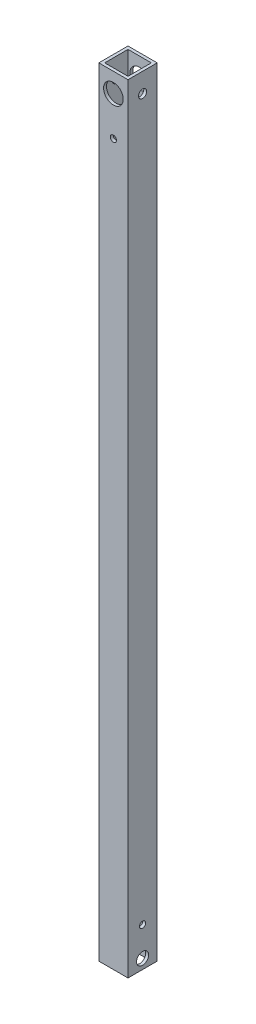
ISO-10303-21;
HEADER;
FILE_DESCRIPTION(('STEP AP214'),'2;1');
FILE_NAME('part.step','',(''),(''),'','','');
FILE_SCHEMA(('AUTOMOTIVE_DESIGN { 1 0 10303 214 1 1 1 1 }'));
ENDSEC;
DATA;
#1=APPLICATION_CONTEXT('core data for automotive mechanical design processes');
#2=APPLICATION_PROTOCOL_DEFINITION('international standard','automotive_design',2000,#1);
#3=PRODUCT_CONTEXT('',#1,'mechanical');
#4=PRODUCT('Part','Part','',(#3));
#5=PRODUCT_RELATED_PRODUCT_CATEGORY('part','',(#4));
#6=PRODUCT_DEFINITION_FORMATION('','',#4);
#7=PRODUCT_DEFINITION_CONTEXT('part definition',#1,'design');
#8=PRODUCT_DEFINITION('design','',#6,#7);
#9=PRODUCT_DEFINITION_SHAPE('','',#8);
#10=(LENGTH_UNIT() NAMED_UNIT(*) SI_UNIT(.MILLI.,.METRE.));
#11=(NAMED_UNIT(*) PLANE_ANGLE_UNIT() SI_UNIT($,.RADIAN.));
#12=(NAMED_UNIT(*) SI_UNIT($,.STERADIAN.) SOLID_ANGLE_UNIT());
#13=UNCERTAINTY_MEASURE_WITH_UNIT(LENGTH_MEASURE(1.E-05),#10,'distance_accuracy_value','');
#14=(GEOMETRIC_REPRESENTATION_CONTEXT(3) GLOBAL_UNCERTAINTY_ASSIGNED_CONTEXT((#13)) GLOBAL_UNIT_ASSIGNED_CONTEXT((#10,
#11,#12)) REPRESENTATION_CONTEXT('',''));
#15=CARTESIAN_POINT('',(0.,0.,0.));
#16=DIRECTION('',(0.,0.,1.));
#17=DIRECTION('',(1.,0.,0.));
#18=AXIS2_PLACEMENT_3D('',#15,#16,#17);
#19=CARTESIAN_POINT('',(0.,400.,0.));
#20=DIRECTION('',(0.,1.,0.));
#21=DIRECTION('',(0.,0.,1.));
#22=AXIS2_PLACEMENT_3D('',#19,#20,#21);
#23=PLANE('',#22);
#24=DIRECTION('',(0.,0.,-1.));
#25=VECTOR('',#24,1.);
#26=CARTESIAN_POINT('',(7.5,400.,-7.5));
#27=LINE('',#26,#25);
#28=CARTESIAN_POINT('',(7.5,400.,7.5));
#29=VERTEX_POINT('',#28);
#30=CARTESIAN_POINT('',(7.5,400.,-7.5));
#31=VERTEX_POINT('',#30);
#32=EDGE_CURVE('E163',#29,#31,#27,.T.);
#33=ORIENTED_EDGE('',*,*,#32,.T.);
#34=DIRECTION('',(-1.,0.,0.));
#35=VECTOR('',#34,1.);
#36=CARTESIAN_POINT('',(-7.5,400.,-7.5));
#37=LINE('',#36,#35);
#38=CARTESIAN_POINT('',(-7.5,400.,-7.5));
#39=VERTEX_POINT('',#38);
#40=EDGE_CURVE('E166',#31,#39,#37,.T.);
#41=ORIENTED_EDGE('',*,*,#40,.T.);
#42=DIRECTION('',(0.,0.,1.));
#43=VECTOR('',#42,1.);
#44=CARTESIAN_POINT('',(-7.5,400.,-7.5));
#45=LINE('',#44,#43);
#46=CARTESIAN_POINT('',(-7.5,400.,7.5));
#47=VERTEX_POINT('',#46);
#48=EDGE_CURVE('E169',#39,#47,#45,.T.);
#49=ORIENTED_EDGE('',*,*,#48,.T.);
#50=DIRECTION('',(1.,0.,0.));
#51=VECTOR('',#50,1.);
#52=CARTESIAN_POINT('',(-7.5,400.,7.5));
#53=LINE('',#52,#51);
#54=EDGE_CURVE('E171',#47,#29,#53,.T.);
#55=ORIENTED_EDGE('',*,*,#54,.T.);
#56=EDGE_LOOP('',(#33,#41,#49,#55));
#57=FACE_BOUND('',#56,.T.);
#58=DIRECTION('',(-1.,0.,0.));
#59=VECTOR('',#58,1.);
#60=CARTESIAN_POINT('',(-7.5,400.,-6.));
#61=LINE('',#60,#59);
#62=CARTESIAN_POINT('',(6.,400.,-6.));
#63=VERTEX_POINT('',#62);
#64=CARTESIAN_POINT('',(-6.,400.,-6.));
#65=VERTEX_POINT('',#64);
#66=EDGE_CURVE('E133',#63,#65,#61,.T.);
#67=ORIENTED_EDGE('',*,*,#66,.F.);
#68=DIRECTION('',(0.,0.,-1.));
#69=VECTOR('',#68,1.);
#70=CARTESIAN_POINT('',(6.,400.,-7.5));
#71=LINE('',#70,#69);
#72=CARTESIAN_POINT('',(6.,400.,6.));
#73=VERTEX_POINT('',#72);
#74=EDGE_CURVE('E125',#73,#63,#71,.T.);
#75=ORIENTED_EDGE('',*,*,#74,.F.);
#76=DIRECTION('',(1.,0.,0.));
#77=VECTOR('',#76,1.);
#78=CARTESIAN_POINT('',(-7.5,400.,6.));
#79=LINE('',#78,#77);
#80=CARTESIAN_POINT('',(-6.,400.,6.));
#81=VERTEX_POINT('',#80);
#82=EDGE_CURVE('E147',#81,#73,#79,.T.);
#83=ORIENTED_EDGE('',*,*,#82,.F.);
#84=DIRECTION('',(0.,0.,1.));
#85=VECTOR('',#84,1.);
#86=CARTESIAN_POINT('',(-6.,400.,-7.5));
#87=LINE('',#86,#85);
#88=EDGE_CURVE('E145',#65,#81,#87,.T.);
#89=ORIENTED_EDGE('',*,*,#88,.F.);
#90=EDGE_LOOP('',(#67,#75,#83,#89));
#91=FACE_BOUND('',#90,.T.);
#92=ADVANCED_FACE('F58',(#57,#91),#23,.T.);
#93=CARTESIAN_POINT('',(0.,0.,0.));
#94=DIRECTION('',(0.,1.,0.));
#95=DIRECTION('',(0.,0.,1.));
#96=AXIS2_PLACEMENT_3D('',#93,#94,#95);
#97=PLANE('',#96);
#98=DIRECTION('',(0.,0.,-1.));
#99=VECTOR('',#98,1.);
#100=CARTESIAN_POINT('',(7.5,0.,-7.5));
#101=LINE('',#100,#99);
#102=CARTESIAN_POINT('',(7.5,0.,7.5));
#103=VERTEX_POINT('',#102);
#104=CARTESIAN_POINT('',(7.5,0.,-7.5));
#105=VERTEX_POINT('',#104);
#106=EDGE_CURVE('E141',#103,#105,#101,.T.);
#107=ORIENTED_EDGE('',*,*,#106,.F.);
#108=DIRECTION('',(1.,0.,0.));
#109=VECTOR('',#108,1.);
#110=CARTESIAN_POINT('',(-7.5,0.,7.5));
#111=LINE('',#110,#109);
#112=CARTESIAN_POINT('',(-7.5,0.,7.5));
#113=VERTEX_POINT('',#112);
#114=EDGE_CURVE('E167',#113,#103,#111,.T.);
#115=ORIENTED_EDGE('',*,*,#114,.F.);
#116=DIRECTION('',(0.,0.,1.));
#117=VECTOR('',#116,1.);
#118=CARTESIAN_POINT('',(-7.5,0.,-7.5));
#119=LINE('',#118,#117);
#120=CARTESIAN_POINT('',(-7.5,0.,-7.5));
#121=VERTEX_POINT('',#120);
#122=EDGE_CURVE('E178',#121,#113,#119,.T.);
#123=ORIENTED_EDGE('',*,*,#122,.F.);
#124=DIRECTION('',(-1.,0.,0.));
#125=VECTOR('',#124,1.);
#126=CARTESIAN_POINT('',(-7.5,0.,-7.5));
#127=LINE('',#126,#125);
#128=EDGE_CURVE('E176',#105,#121,#127,.T.);
#129=ORIENTED_EDGE('',*,*,#128,.F.);
#130=EDGE_LOOP('',(#107,#115,#123,#129));
#131=FACE_BOUND('',#130,.T.);
#132=DIRECTION('',(0.,0.,-1.));
#133=VECTOR('',#132,1.);
#134=CARTESIAN_POINT('',(6.,0.,-7.5));
#135=LINE('',#134,#133);
#136=CARTESIAN_POINT('',(6.,0.,6.));
#137=VERTEX_POINT('',#136);
#138=CARTESIAN_POINT('',(6.,0.,-6.));
#139=VERTEX_POINT('',#138);
#140=EDGE_CURVE('E83',#137,#139,#135,.T.);
#141=ORIENTED_EDGE('',*,*,#140,.T.);
#142=DIRECTION('',(-1.,0.,0.));
#143=VECTOR('',#142,1.);
#144=CARTESIAN_POINT('',(-7.5,0.,-6.));
#145=LINE('',#144,#143);
#146=CARTESIAN_POINT('',(-6.,0.,-6.));
#147=VERTEX_POINT('',#146);
#148=EDGE_CURVE('E140',#139,#147,#145,.T.);
#149=ORIENTED_EDGE('',*,*,#148,.T.);
#150=DIRECTION('',(0.,0.,1.));
#151=VECTOR('',#150,1.);
#152=CARTESIAN_POINT('',(-6.,0.,-7.5));
#153=LINE('',#152,#151);
#154=CARTESIAN_POINT('',(-6.,0.,6.));
#155=VERTEX_POINT('',#154);
#156=EDGE_CURVE('E155',#147,#155,#153,.T.);
#157=ORIENTED_EDGE('',*,*,#156,.T.);
#158=DIRECTION('',(1.,0.,0.));
#159=VECTOR('',#158,1.);
#160=CARTESIAN_POINT('',(-7.5,0.,6.));
#161=LINE('',#160,#159);
#162=EDGE_CURVE('E134',#155,#137,#161,.T.);
#163=ORIENTED_EDGE('',*,*,#162,.T.);
#164=EDGE_LOOP('',(#141,#149,#157,#163));
#165=FACE_BOUND('',#164,.T.);
#166=ADVANCED_FACE('F272',(#131,#165),#97,.F.);
#167=CARTESIAN_POINT('',(7.5,400.,-7.5));
#168=DIRECTION('',(-1.,0.,0.));
#169=DIRECTION('',(0.,0.,1.));
#170=AXIS2_PLACEMENT_3D('',#167,#168,#169);
#171=PLANE('',#170);
#172=CARTESIAN_POINT('',(7.5,20.,0.));
#173=DIRECTION('',(1.,0.,0.));
#174=DIRECTION('',(0.,0.,-1.));
#175=AXIS2_PLACEMENT_3D('',#172,#173,#174);
#176=CIRCLE('',#175,1.6);
#177=CARTESIAN_POINT('',(7.5,20.,-1.6));
#178=VERTEX_POINT('',#177);
#179=EDGE_CURVE('E338',#178,#178,#176,.T.);
#180=ORIENTED_EDGE('',*,*,#179,.F.);
#181=EDGE_LOOP('',(#180));
#182=FACE_BOUND('',#181,.T.);
#183=CARTESIAN_POINT('',(7.5,5.,0.));
#184=DIRECTION('',(1.,0.,0.));
#185=DIRECTION('',(0.,0.,-1.));
#186=AXIS2_PLACEMENT_3D('',#183,#184,#185);
#187=CIRCLE('',#186,3.1);
#188=CARTESIAN_POINT('',(7.5,5.,-3.1));
#189=VERTEX_POINT('',#188);
#190=EDGE_CURVE('E210',#189,#189,#187,.T.);
#191=ORIENTED_EDGE('',*,*,#190,.F.);
#192=EDGE_LOOP('',(#191));
#193=FACE_BOUND('',#192,.T.);
#194=CARTESIAN_POINT('',(7.5,390.,0.));
#195=DIRECTION('',(1.,0.,0.));
#196=DIRECTION('',(0.,0.,-1.));
#197=AXIS2_PLACEMENT_3D('',#194,#195,#196);
#198=CIRCLE('',#197,2.09999999999998);
#199=CARTESIAN_POINT('',(7.5,390.,-2.09999999999998));
#200=VERTEX_POINT('',#199);
#201=EDGE_CURVE('E207',#200,#200,#198,.T.);
#202=ORIENTED_EDGE('',*,*,#201,.F.);
#203=EDGE_LOOP('',(#202));
#204=FACE_BOUND('',#203,.T.);
#205=ORIENTED_EDGE('',*,*,#106,.T.);
#206=DIRECTION('',(0.,-1.,0.));
#207=VECTOR('',#206,1.);
#208=CARTESIAN_POINT('',(7.5,400.,-7.5));
#209=LINE('',#208,#207);
#210=EDGE_CURVE('E12',#31,#105,#209,.T.);
#211=ORIENTED_EDGE('',*,*,#210,.F.);
#212=ORIENTED_EDGE('',*,*,#32,.F.);
#213=DIRECTION('',(0.,-1.,0.));
#214=VECTOR('',#213,1.);
#215=CARTESIAN_POINT('',(7.5,400.,7.5));
#216=LINE('',#215,#214);
#217=EDGE_CURVE('E173',#29,#103,#216,.T.);
#218=ORIENTED_EDGE('',*,*,#217,.T.);
#219=EDGE_LOOP('',(#205,#211,#212,#218));
#220=FACE_BOUND('',#219,.T.);
#221=ADVANCED_FACE('F60',(#182,#193,#204,#220),#171,.F.);
#222=CARTESIAN_POINT('',(-7.5,400.,-7.5));
#223=DIRECTION('',(0.,0.,1.));
#224=DIRECTION('',(1.,0.,0.));
#225=AXIS2_PLACEMENT_3D('',#222,#223,#224);
#226=PLANE('',#225);
#227=CARTESIAN_POINT('',(0.,390.,-7.5));
#228=DIRECTION('',(0.,0.,1.));
#229=DIRECTION('',(1.,0.,0.));
#230=AXIS2_PLACEMENT_3D('',#227,#228,#229);
#231=CIRCLE('',#230,5.05000000000005);
#232=CARTESIAN_POINT('',(5.05000000000005,390.,-7.5));
#233=VERTEX_POINT('',#232);
#234=EDGE_CURVE('E192',#233,#233,#231,.T.);
#235=ORIENTED_EDGE('',*,*,#234,.T.);
#236=EDGE_LOOP('',(#235));
#237=FACE_BOUND('',#236,.T.);
#238=CARTESIAN_POINT('',(0.,370.,-7.5));
#239=DIRECTION('',(0.,0.,1.));
#240=DIRECTION('',(1.,0.,0.));
#241=AXIS2_PLACEMENT_3D('',#238,#239,#240);
#242=CIRCLE('',#241,1.59999999999998);
#243=CARTESIAN_POINT('',(1.59999999999998,370.,-7.5));
#244=VERTEX_POINT('',#243);
#245=EDGE_CURVE('E232',#244,#244,#242,.T.);
#246=ORIENTED_EDGE('',*,*,#245,.T.);
#247=EDGE_LOOP('',(#246));
#248=FACE_BOUND('',#247,.T.);
#249=ORIENTED_EDGE('',*,*,#128,.T.);
#250=DIRECTION('',(0.,-1.,0.));
#251=VECTOR('',#250,1.);
#252=CARTESIAN_POINT('',(-7.5,400.,-7.5));
#253=LINE('',#252,#251);
#254=EDGE_CURVE('E67',#39,#121,#253,.T.);
#255=ORIENTED_EDGE('',*,*,#254,.F.);
#256=ORIENTED_EDGE('',*,*,#40,.F.);
#257=ORIENTED_EDGE('',*,*,#210,.T.);
#258=EDGE_LOOP('',(#249,#255,#256,#257));
#259=FACE_BOUND('',#258,.T.);
#260=ADVANCED_FACE('F258',(#237,#248,#259),#226,.F.);
#261=CARTESIAN_POINT('',(-7.5,400.,-7.5));
#262=DIRECTION('',(1.,0.,0.));
#263=DIRECTION('',(0.,0.,-1.));
#264=AXIS2_PLACEMENT_3D('',#261,#262,#263);
#265=PLANE('',#264);
#266=CARTESIAN_POINT('',(-7.5,20.,0.));
#267=DIRECTION('',(1.,0.,0.));
#268=DIRECTION('',(0.,0.,-1.));
#269=AXIS2_PLACEMENT_3D('',#266,#267,#268);
#270=CIRCLE('',#269,1.6);
#271=CARTESIAN_POINT('',(-7.5,20.,-1.6));
#272=VERTEX_POINT('',#271);
#273=EDGE_CURVE('E298',#272,#272,#270,.T.);
#274=ORIENTED_EDGE('',*,*,#273,.T.);
#275=EDGE_LOOP('',(#274));
#276=FACE_BOUND('',#275,.T.);
#277=CARTESIAN_POINT('',(-7.5,5.,0.));
#278=DIRECTION('',(1.,0.,0.));
#279=DIRECTION('',(0.,0.,-1.));
#280=AXIS2_PLACEMENT_3D('',#277,#278,#279);
#281=CIRCLE('',#280,3.1);
#282=CARTESIAN_POINT('',(-7.5,5.,-3.1));
#283=VERTEX_POINT('',#282);
#284=EDGE_CURVE('E203',#283,#283,#281,.T.);
#285=ORIENTED_EDGE('',*,*,#284,.T.);
#286=EDGE_LOOP('',(#285));
#287=FACE_BOUND('',#286,.T.);
#288=CARTESIAN_POINT('',(-7.5,390.,0.));
#289=DIRECTION('',(1.,0.,0.));
#290=DIRECTION('',(0.,0.,-1.));
#291=AXIS2_PLACEMENT_3D('',#288,#289,#290);
#292=CIRCLE('',#291,2.09999999999998);
#293=CARTESIAN_POINT('',(-7.5,390.,-2.09999999999998));
#294=VERTEX_POINT('',#293);
#295=EDGE_CURVE('E199',#294,#294,#292,.T.);
#296=ORIENTED_EDGE('',*,*,#295,.T.);
#297=EDGE_LOOP('',(#296));
#298=FACE_BOUND('',#297,.T.);
#299=ORIENTED_EDGE('',*,*,#122,.T.);
#300=DIRECTION('',(0.,-1.,0.));
#301=VECTOR('',#300,1.);
#302=CARTESIAN_POINT('',(-7.5,400.,7.5));
#303=LINE('',#302,#301);
#304=EDGE_CURVE('E183',#47,#113,#303,.T.);
#305=ORIENTED_EDGE('',*,*,#304,.F.);
#306=ORIENTED_EDGE('',*,*,#48,.F.);
#307=ORIENTED_EDGE('',*,*,#254,.T.);
#308=EDGE_LOOP('',(#299,#305,#306,#307));
#309=FACE_BOUND('',#308,.T.);
#310=ADVANCED_FACE('F261',(#276,#287,#298,#309),#265,.F.);
#311=CARTESIAN_POINT('',(-7.5,400.,7.5));
#312=DIRECTION('',(0.,0.,-1.));
#313=DIRECTION('',(-1.,0.,0.));
#314=AXIS2_PLACEMENT_3D('',#311,#312,#313);
#315=PLANE('',#314);
#316=CARTESIAN_POINT('',(0.,390.,7.5));
#317=DIRECTION('',(0.,0.,1.));
#318=DIRECTION('',(1.,0.,0.));
#319=AXIS2_PLACEMENT_3D('',#316,#317,#318);
#320=CIRCLE('',#319,5.05000000000005);
#321=CARTESIAN_POINT('',(5.05000000000005,390.,7.5));
#322=VERTEX_POINT('',#321);
#323=EDGE_CURVE('E229',#322,#322,#320,.T.);
#324=ORIENTED_EDGE('',*,*,#323,.F.);
#325=EDGE_LOOP('',(#324));
#326=FACE_BOUND('',#325,.T.);
#327=CARTESIAN_POINT('',(0.,370.,7.5));
#328=DIRECTION('',(0.,0.,1.));
#329=DIRECTION('',(1.,0.,0.));
#330=AXIS2_PLACEMENT_3D('',#327,#328,#329);
#331=CIRCLE('',#330,1.59999999999998);
#332=CARTESIAN_POINT('',(1.59999999999998,370.,7.5));
#333=VERTEX_POINT('',#332);
#334=EDGE_CURVE('E226',#333,#333,#331,.T.);
#335=ORIENTED_EDGE('',*,*,#334,.F.);
#336=EDGE_LOOP('',(#335));
#337=FACE_BOUND('',#336,.T.);
#338=ORIENTED_EDGE('',*,*,#114,.T.);
#339=ORIENTED_EDGE('',*,*,#217,.F.);
#340=ORIENTED_EDGE('',*,*,#54,.F.);
#341=ORIENTED_EDGE('',*,*,#304,.T.);
#342=EDGE_LOOP('',(#338,#339,#340,#341));
#343=FACE_BOUND('',#342,.T.);
#344=ADVANCED_FACE('F276',(#326,#337,#343),#315,.F.);
#345=CARTESIAN_POINT('',(6.,400.,-7.5));
#346=DIRECTION('',(-1.,0.,0.));
#347=DIRECTION('',(0.,0.,1.));
#348=AXIS2_PLACEMENT_3D('',#345,#346,#347);
#349=PLANE('',#348);
#350=CARTESIAN_POINT('',(6.,20.,0.));
#351=DIRECTION('',(-1.,0.,0.));
#352=DIRECTION('',(0.,0.,1.));
#353=AXIS2_PLACEMENT_3D('',#350,#351,#352);
#354=CIRCLE('',#353,1.6);
#355=CARTESIAN_POINT('',(6.,20.,1.6));
#356=VERTEX_POINT('',#355);
#357=EDGE_CURVE('E215',#356,#356,#354,.T.);
#358=ORIENTED_EDGE('',*,*,#357,.F.);
#359=EDGE_LOOP('',(#358));
#360=FACE_BOUND('',#359,.T.);
#361=CARTESIAN_POINT('',(6.,5.,0.));
#362=DIRECTION('',(-1.,0.,0.));
#363=DIRECTION('',(0.,0.,1.));
#364=AXIS2_PLACEMENT_3D('',#361,#362,#363);
#365=CIRCLE('',#364,3.1);
#366=CARTESIAN_POINT('',(6.,5.,-3.1));
#367=VERTEX_POINT('',#366);
#368=EDGE_CURVE('E202',#367,#367,#365,.T.);
#369=ORIENTED_EDGE('',*,*,#368,.F.);
#370=EDGE_LOOP('',(#369));
#371=FACE_BOUND('',#370,.T.);
#372=CARTESIAN_POINT('',(6.,390.,0.));
#373=DIRECTION('',(-1.,0.,0.));
#374=DIRECTION('',(0.,0.,1.));
#375=AXIS2_PLACEMENT_3D('',#372,#373,#374);
#376=CIRCLE('',#375,2.09999999999998);
#377=CARTESIAN_POINT('',(6.,390.,-2.09999999999998));
#378=VERTEX_POINT('',#377);
#379=EDGE_CURVE('E198',#378,#378,#376,.T.);
#380=ORIENTED_EDGE('',*,*,#379,.F.);
#381=EDGE_LOOP('',(#380));
#382=FACE_BOUND('',#381,.T.);
#383=ORIENTED_EDGE('',*,*,#140,.F.);
#384=DIRECTION('',(0.,-1.,0.));
#385=VECTOR('',#384,1.);
#386=CARTESIAN_POINT('',(6.,400.,6.));
#387=LINE('',#386,#385);
#388=EDGE_CURVE('E129',#73,#137,#387,.T.);
#389=ORIENTED_EDGE('',*,*,#388,.F.);
#390=ORIENTED_EDGE('',*,*,#74,.T.);
#391=DIRECTION('',(0.,-1.,0.));
#392=VECTOR('',#391,1.);
#393=CARTESIAN_POINT('',(6.,400.,-6.));
#394=LINE('',#393,#392);
#395=EDGE_CURVE('E128',#63,#139,#394,.T.);
#396=ORIENTED_EDGE('',*,*,#395,.T.);
#397=EDGE_LOOP('',(#383,#389,#390,#396));
#398=FACE_BOUND('',#397,.T.);
#399=ADVANCED_FACE('F127',(#360,#371,#382,#398),#349,.T.);
#400=CARTESIAN_POINT('',(-7.5,400.,-6.));
#401=DIRECTION('',(0.,0.,1.));
#402=DIRECTION('',(1.,0.,0.));
#403=AXIS2_PLACEMENT_3D('',#400,#401,#402);
#404=PLANE('',#403);
#405=CARTESIAN_POINT('',(0.,390.,-6.));
#406=DIRECTION('',(0.,0.,1.));
#407=DIRECTION('',(1.,0.,0.));
#408=AXIS2_PLACEMENT_3D('',#405,#406,#407);
#409=CIRCLE('',#408,5.05000000000005);
#410=CARTESIAN_POINT('',(5.05000000000005,390.,-6.));
#411=VERTEX_POINT('',#410);
#412=EDGE_CURVE('E153',#411,#411,#409,.T.);
#413=ORIENTED_EDGE('',*,*,#412,.F.);
#414=EDGE_LOOP('',(#413));
#415=FACE_BOUND('',#414,.T.);
#416=CARTESIAN_POINT('',(0.,370.,-6.));
#417=DIRECTION('',(0.,0.,1.));
#418=DIRECTION('',(1.,0.,0.));
#419=AXIS2_PLACEMENT_3D('',#416,#417,#418);
#420=CIRCLE('',#419,1.59999999999998);
#421=CARTESIAN_POINT('',(1.59999999999998,370.,-6.));
#422=VERTEX_POINT('',#421);
#423=EDGE_CURVE('E191',#422,#422,#420,.T.);
#424=ORIENTED_EDGE('',*,*,#423,.F.);
#425=EDGE_LOOP('',(#424));
#426=FACE_BOUND('',#425,.T.);
#427=ORIENTED_EDGE('',*,*,#148,.F.);
#428=ORIENTED_EDGE('',*,*,#395,.F.);
#429=ORIENTED_EDGE('',*,*,#66,.T.);
#430=DIRECTION('',(0.,-1.,0.));
#431=VECTOR('',#430,1.);
#432=CARTESIAN_POINT('',(-6.,400.,-6.));
#433=LINE('',#432,#431);
#434=EDGE_CURVE('E142',#65,#147,#433,.T.);
#435=ORIENTED_EDGE('',*,*,#434,.T.);
#436=EDGE_LOOP('',(#427,#428,#429,#435));
#437=FACE_BOUND('',#436,.T.);
#438=ADVANCED_FACE('F137',(#415,#426,#437),#404,.T.);
#439=CARTESIAN_POINT('',(-6.,400.,-7.5));
#440=DIRECTION('',(1.,0.,0.));
#441=DIRECTION('',(0.,0.,-1.));
#442=AXIS2_PLACEMENT_3D('',#439,#440,#441);
#443=PLANE('',#442);
#444=CARTESIAN_POINT('',(-6.,20.,0.));
#445=DIRECTION('',(1.,0.,0.));
#446=DIRECTION('',(0.,0.,-1.));
#447=AXIS2_PLACEMENT_3D('',#444,#445,#446);
#448=CIRCLE('',#447,1.6);
#449=CARTESIAN_POINT('',(-6.,20.,-1.6));
#450=VERTEX_POINT('',#449);
#451=EDGE_CURVE('E62',#450,#450,#448,.T.);
#452=ORIENTED_EDGE('',*,*,#451,.F.);
#453=EDGE_LOOP('',(#452));
#454=FACE_BOUND('',#453,.T.);
#455=CARTESIAN_POINT('',(-6.,5.,0.));
#456=DIRECTION('',(1.,0.,0.));
#457=DIRECTION('',(0.,0.,-1.));
#458=AXIS2_PLACEMENT_3D('',#455,#456,#457);
#459=CIRCLE('',#458,3.1);
#460=CARTESIAN_POINT('',(-6.,5.,-3.1));
#461=VERTEX_POINT('',#460);
#462=EDGE_CURVE('E200',#461,#461,#459,.T.);
#463=ORIENTED_EDGE('',*,*,#462,.F.);
#464=EDGE_LOOP('',(#463));
#465=FACE_BOUND('',#464,.T.);
#466=CARTESIAN_POINT('',(-6.,390.,0.));
#467=DIRECTION('',(1.,0.,0.));
#468=DIRECTION('',(0.,0.,-1.));
#469=AXIS2_PLACEMENT_3D('',#466,#467,#468);
#470=CIRCLE('',#469,2.09999999999998);
#471=CARTESIAN_POINT('',(-6.,390.,-2.09999999999998));
#472=VERTEX_POINT('',#471);
#473=EDGE_CURVE('E196',#472,#472,#470,.T.);
#474=ORIENTED_EDGE('',*,*,#473,.F.);
#475=EDGE_LOOP('',(#474));
#476=FACE_BOUND('',#475,.T.);
#477=ORIENTED_EDGE('',*,*,#156,.F.);
#478=ORIENTED_EDGE('',*,*,#434,.F.);
#479=ORIENTED_EDGE('',*,*,#88,.T.);
#480=DIRECTION('',(0.,-1.,0.));
#481=VECTOR('',#480,1.);
#482=CARTESIAN_POINT('',(-6.,400.,6.));
#483=LINE('',#482,#481);
#484=EDGE_CURVE('E75',#81,#155,#483,.T.);
#485=ORIENTED_EDGE('',*,*,#484,.T.);
#486=EDGE_LOOP('',(#477,#478,#479,#485));
#487=FACE_BOUND('',#486,.T.);
#488=ADVANCED_FACE('F246',(#454,#465,#476,#487),#443,.T.);
#489=CARTESIAN_POINT('',(-7.5,400.,6.));
#490=DIRECTION('',(0.,0.,-1.));
#491=DIRECTION('',(-1.,0.,0.));
#492=AXIS2_PLACEMENT_3D('',#489,#490,#491);
#493=PLANE('',#492);
#494=CARTESIAN_POINT('',(0.,390.,6.));
#495=DIRECTION('',(0.,0.,-1.));
#496=DIRECTION('',(-1.,0.,0.));
#497=AXIS2_PLACEMENT_3D('',#494,#495,#496);
#498=CIRCLE('',#497,5.05000000000005);
#499=CARTESIAN_POINT('',(-5.05000000000005,390.,6.));
#500=VERTEX_POINT('',#499);
#501=EDGE_CURVE('E193',#500,#500,#498,.T.);
#502=ORIENTED_EDGE('',*,*,#501,.F.);
#503=EDGE_LOOP('',(#502));
#504=FACE_BOUND('',#503,.T.);
#505=CARTESIAN_POINT('',(0.,370.,6.));
#506=DIRECTION('',(0.,0.,-1.));
#507=DIRECTION('',(-1.,0.,0.));
#508=AXIS2_PLACEMENT_3D('',#505,#506,#507);
#509=CIRCLE('',#508,1.59999999999998);
#510=CARTESIAN_POINT('',(-1.59999999999998,370.,6.));
#511=VERTEX_POINT('',#510);
#512=EDGE_CURVE('E188',#511,#511,#509,.T.);
#513=ORIENTED_EDGE('',*,*,#512,.F.);
#514=EDGE_LOOP('',(#513));
#515=FACE_BOUND('',#514,.T.);
#516=ORIENTED_EDGE('',*,*,#162,.F.);
#517=ORIENTED_EDGE('',*,*,#484,.F.);
#518=ORIENTED_EDGE('',*,*,#82,.T.);
#519=ORIENTED_EDGE('',*,*,#388,.T.);
#520=EDGE_LOOP('',(#516,#517,#518,#519));
#521=FACE_BOUND('',#520,.T.);
#522=ADVANCED_FACE('F320',(#504,#515,#521),#493,.T.);
#523=CARTESIAN_POINT('',(0.,370.,-7.5));
#524=DIRECTION('',(0.,0.,1.));
#525=DIRECTION('',(1.,0.,0.));
#526=AXIS2_PLACEMENT_3D('',#523,#524,#525);
#527=CYLINDRICAL_SURFACE('',#526,1.59999999999998);
#528=ORIENTED_EDGE('',*,*,#512,.T.);
#529=EDGE_LOOP('',(#528));
#530=FACE_BOUND('',#529,.T.);
#531=ORIENTED_EDGE('',*,*,#334,.T.);
#532=EDGE_LOOP('',(#531));
#533=FACE_BOUND('',#532,.T.);
#534=ADVANCED_FACE('F255',(#530,#533),#527,.F.);
#535=CARTESIAN_POINT('',(0.,390.,-7.5));
#536=DIRECTION('',(0.,0.,1.));
#537=DIRECTION('',(1.,0.,0.));
#538=AXIS2_PLACEMENT_3D('',#535,#536,#537);
#539=CYLINDRICAL_SURFACE('',#538,5.05000000000005);
#540=ORIENTED_EDGE('',*,*,#501,.T.);
#541=EDGE_LOOP('',(#540));
#542=FACE_BOUND('',#541,.T.);
#543=ORIENTED_EDGE('',*,*,#323,.T.);
#544=EDGE_LOOP('',(#543));
#545=FACE_BOUND('',#544,.T.);
#546=ADVANCED_FACE('F253',(#542,#545),#539,.F.);
#547=ORIENTED_EDGE('',*,*,#423,.T.);
#548=EDGE_LOOP('',(#547));
#549=FACE_BOUND('',#548,.T.);
#550=ORIENTED_EDGE('',*,*,#245,.F.);
#551=EDGE_LOOP('',(#550));
#552=FACE_BOUND('',#551,.T.);
#553=ADVANCED_FACE('F250',(#549,#552),#527,.F.);
#554=ORIENTED_EDGE('',*,*,#412,.T.);
#555=EDGE_LOOP('',(#554));
#556=FACE_BOUND('',#555,.T.);
#557=ORIENTED_EDGE('',*,*,#234,.F.);
#558=EDGE_LOOP('',(#557));
#559=FACE_BOUND('',#558,.T.);
#560=ADVANCED_FACE('F241',(#556,#559),#539,.F.);
#561=CARTESIAN_POINT('',(-7.5,390.,0.));
#562=DIRECTION('',(1.,0.,0.));
#563=DIRECTION('',(0.,0.,-1.));
#564=AXIS2_PLACEMENT_3D('',#561,#562,#563);
#565=CYLINDRICAL_SURFACE('',#564,2.09999999999998);
#566=CARTESIAN_POINT('',(-6.,390.,-2.09999999999998));
#567=CARTESIAN_POINT('',(-6.015625,390.,-2.09999999999998));
#568=CARTESIAN_POINT('',(-6.03125,390.,-2.09999999999998));
#569=CARTESIAN_POINT('',(-6.0625,390.,-2.09999999999998));
#570=CARTESIAN_POINT('',(-6.078125,390.,-2.09999999999998));
#571=CARTESIAN_POINT('',(-6.109375,390.,-2.09999999999998));
#572=CARTESIAN_POINT('',(-6.125,390.,-2.09999999999998));
#573=CARTESIAN_POINT('',(-6.15625,390.,-2.09999999999998));
#574=CARTESIAN_POINT('',(-6.171875,390.,-2.09999999999998));
#575=CARTESIAN_POINT('',(-6.203125,390.,-2.09999999999998));
#576=CARTESIAN_POINT('',(-6.21875,390.,-2.09999999999998));
#577=CARTESIAN_POINT('',(-6.25,390.,-2.09999999999998));
#578=CARTESIAN_POINT('',(-6.265625,390.,-2.09999999999998));
#579=CARTESIAN_POINT('',(-6.296875,390.,-2.09999999999998));
#580=CARTESIAN_POINT('',(-6.3125,390.,-2.09999999999998));
#581=CARTESIAN_POINT('',(-6.34375,390.,-2.09999999999998));
#582=CARTESIAN_POINT('',(-6.359375,390.,-2.09999999999998));
#583=CARTESIAN_POINT('',(-6.390625,390.,-2.09999999999998));
#584=CARTESIAN_POINT('',(-6.40625,390.,-2.09999999999998));
#585=CARTESIAN_POINT('',(-6.4375,390.,-2.09999999999998));
#586=CARTESIAN_POINT('',(-6.453125,390.,-2.09999999999998));
#587=CARTESIAN_POINT('',(-6.484375,390.,-2.09999999999998));
#588=CARTESIAN_POINT('',(-6.5,390.,-2.09999999999998));
#589=CARTESIAN_POINT('',(-6.53125,390.,-2.09999999999998));
#590=CARTESIAN_POINT('',(-6.546875,390.,-2.09999999999998));
#591=CARTESIAN_POINT('',(-6.578125,390.,-2.09999999999998));
#592=CARTESIAN_POINT('',(-6.59375,390.,-2.09999999999998));
#593=CARTESIAN_POINT('',(-6.625,390.,-2.09999999999998));
#594=CARTESIAN_POINT('',(-6.640625,390.,-2.09999999999998));
#595=CARTESIAN_POINT('',(-6.671875,390.,-2.09999999999998));
#596=CARTESIAN_POINT('',(-6.6875,390.,-2.09999999999998));
#597=CARTESIAN_POINT('',(-6.71875,390.,-2.09999999999998));
#598=CARTESIAN_POINT('',(-6.734375,390.,-2.09999999999998));
#599=CARTESIAN_POINT('',(-6.765625,390.,-2.09999999999998));
#600=CARTESIAN_POINT('',(-6.78125,390.,-2.09999999999998));
#601=CARTESIAN_POINT('',(-6.8125,390.,-2.09999999999998));
#602=CARTESIAN_POINT('',(-6.828125,390.,-2.09999999999998));
#603=CARTESIAN_POINT('',(-6.859375,390.,-2.09999999999998));
#604=CARTESIAN_POINT('',(-6.875,390.,-2.09999999999998));
#605=CARTESIAN_POINT('',(-6.90625,390.,-2.09999999999998));
#606=CARTESIAN_POINT('',(-6.921875,390.,-2.09999999999998));
#607=CARTESIAN_POINT('',(-6.953125,390.,-2.09999999999998));
#608=CARTESIAN_POINT('',(-6.96875,390.,-2.09999999999998));
#609=CARTESIAN_POINT('',(-7.,390.,-2.09999999999998));
#610=CARTESIAN_POINT('',(-7.015625,390.,-2.09999999999998));
#611=CARTESIAN_POINT('',(-7.046875,390.,-2.09999999999998));
#612=CARTESIAN_POINT('',(-7.0625,390.,-2.09999999999998));
#613=CARTESIAN_POINT('',(-7.09375,390.,-2.09999999999998));
#614=CARTESIAN_POINT('',(-7.109375,390.,-2.09999999999998));
#615=CARTESIAN_POINT('',(-7.140625,390.,-2.09999999999998));
#616=CARTESIAN_POINT('',(-7.15625,390.,-2.09999999999998));
#617=CARTESIAN_POINT('',(-7.1875,390.,-2.09999999999998));
#618=CARTESIAN_POINT('',(-7.203125,390.,-2.09999999999998));
#619=CARTESIAN_POINT('',(-7.234375,390.,-2.09999999999998));
#620=CARTESIAN_POINT('',(-7.25,390.,-2.09999999999998));
#621=CARTESIAN_POINT('',(-7.28125,390.,-2.09999999999998));
#622=CARTESIAN_POINT('',(-7.296875,390.,-2.09999999999998));
#623=CARTESIAN_POINT('',(-7.328125,390.,-2.09999999999998));
#624=CARTESIAN_POINT('',(-7.34375,390.,-2.09999999999998));
#625=CARTESIAN_POINT('',(-7.375,390.,-2.09999999999998));
#626=CARTESIAN_POINT('',(-7.390625,390.,-2.09999999999998));
#627=CARTESIAN_POINT('',(-7.421875,390.,-2.09999999999998));
#628=CARTESIAN_POINT('',(-7.4375,390.,-2.09999999999998));
#629=CARTESIAN_POINT('',(-7.46875,390.,-2.09999999999998));
#630=CARTESIAN_POINT('',(-7.484375,390.,-2.09999999999998));
#631=CARTESIAN_POINT('',(-7.5,390.,-2.09999999999998));
#632=B_SPLINE_CURVE_WITH_KNOTS('',3,(#566,#567,#568,#569,#570,#571,#572,#573,#574,#575,#576,
#577,#578,#579,#580,#581,#582,#583,#584,#585,#586,#587,#588,#589,#590,#591,#592,#593,#594,#595,
#596,#597,#598,#599,#600,#601,#602,#603,#604,#605,#606,#607,#608,#609,#610,#611,#612,#613,#614,
#615,#616,#617,#618,#619,#620,#621,#622,#623,#624,#625,#626,#627,#628,#629,#630,#631),
.UNSPECIFIED.,.F.,.F.,(4,2,2,2,2,2,2,2,2,2,2,2,2,2,2,2,2,2,2,2,2,2,2,2,2,2,2,2,2,2,2,2,4),(0.,
0.046875,0.0937500000000001,0.140625,0.1875,0.234375,0.28125,0.328125,0.375000000000001,
0.421875000000001,0.468750000000001,0.515625000000001,0.562500000000001,0.609375000000001,
0.656250000000001,0.703125000000001,0.750000000000002,0.796875000000002,0.843750000000002,
0.890625000000002,0.937500000000002,0.984375000000003,1.03125,1.078125,1.125,1.171875,1.21875,
1.265625,1.3125,1.359375,1.40625,1.453125,1.5),.UNSPECIFIED.);
#633=EDGE_CURVE('BSEAM302',#472,#294,#632,.T.);
#634=ORIENTED_EDGE('',*,*,#473,.T.);
#635=ORIENTED_EDGE('',*,*,#295,.F.);
#636=ORIENTED_EDGE('',*,*,#633,.T.);
#637=ORIENTED_EDGE('',*,*,#633,.F.);
#638=EDGE_LOOP('',(#634,#636,#635,#637));
#639=FACE_BOUND('',#638,.T.);
#640=ADVANCED_FACE('F302',(#639),#565,.F.);
#641=CARTESIAN_POINT('',(6.,390.,-2.09999999999998));
#642=CARTESIAN_POINT('',(6.015625,390.,-2.09999999999998));
#643=CARTESIAN_POINT('',(6.03125,390.,-2.09999999999998));
#644=CARTESIAN_POINT('',(6.0625,390.,-2.09999999999998));
#645=CARTESIAN_POINT('',(6.078125,390.,-2.09999999999998));
#646=CARTESIAN_POINT('',(6.109375,390.,-2.09999999999998));
#647=CARTESIAN_POINT('',(6.125,390.,-2.09999999999998));
#648=CARTESIAN_POINT('',(6.15625,390.,-2.09999999999998));
#649=CARTESIAN_POINT('',(6.171875,390.,-2.09999999999998));
#650=CARTESIAN_POINT('',(6.203125,390.,-2.09999999999998));
#651=CARTESIAN_POINT('',(6.21875,390.,-2.09999999999998));
#652=CARTESIAN_POINT('',(6.25,390.,-2.09999999999998));
#653=CARTESIAN_POINT('',(6.265625,390.,-2.09999999999998));
#654=CARTESIAN_POINT('',(6.296875,390.,-2.09999999999998));
#655=CARTESIAN_POINT('',(6.3125,390.,-2.09999999999998));
#656=CARTESIAN_POINT('',(6.34375,390.,-2.09999999999998));
#657=CARTESIAN_POINT('',(6.359375,390.,-2.09999999999998));
#658=CARTESIAN_POINT('',(6.390625,390.,-2.09999999999998));
#659=CARTESIAN_POINT('',(6.40625,390.,-2.09999999999998));
#660=CARTESIAN_POINT('',(6.4375,390.,-2.09999999999998));
#661=CARTESIAN_POINT('',(6.453125,390.,-2.09999999999998));
#662=CARTESIAN_POINT('',(6.484375,390.,-2.09999999999998));
#663=CARTESIAN_POINT('',(6.5,390.,-2.09999999999998));
#664=CARTESIAN_POINT('',(6.53125,390.,-2.09999999999998));
#665=CARTESIAN_POINT('',(6.546875,390.,-2.09999999999998));
#666=CARTESIAN_POINT('',(6.578125,390.,-2.09999999999998));
#667=CARTESIAN_POINT('',(6.59375,390.,-2.09999999999998));
#668=CARTESIAN_POINT('',(6.625,390.,-2.09999999999998));
#669=CARTESIAN_POINT('',(6.640625,390.,-2.09999999999998));
#670=CARTESIAN_POINT('',(6.671875,390.,-2.09999999999998));
#671=CARTESIAN_POINT('',(6.6875,390.,-2.09999999999998));
#672=CARTESIAN_POINT('',(6.71875,390.,-2.09999999999998));
#673=CARTESIAN_POINT('',(6.734375,390.,-2.09999999999998));
#674=CARTESIAN_POINT('',(6.765625,390.,-2.09999999999998));
#675=CARTESIAN_POINT('',(6.78125,390.,-2.09999999999998));
#676=CARTESIAN_POINT('',(6.8125,390.,-2.09999999999998));
#677=CARTESIAN_POINT('',(6.828125,390.,-2.09999999999998));
#678=CARTESIAN_POINT('',(6.859375,390.,-2.09999999999998));
#679=CARTESIAN_POINT('',(6.875,390.,-2.09999999999998));
#680=CARTESIAN_POINT('',(6.90625,390.,-2.09999999999998));
#681=CARTESIAN_POINT('',(6.921875,390.,-2.09999999999998));
#682=CARTESIAN_POINT('',(6.953125,390.,-2.09999999999998));
#683=CARTESIAN_POINT('',(6.96875,390.,-2.09999999999998));
#684=CARTESIAN_POINT('',(7.,390.,-2.09999999999998));
#685=CARTESIAN_POINT('',(7.015625,390.,-2.09999999999998));
#686=CARTESIAN_POINT('',(7.046875,390.,-2.09999999999998));
#687=CARTESIAN_POINT('',(7.0625,390.,-2.09999999999998));
#688=CARTESIAN_POINT('',(7.09375,390.,-2.09999999999998));
#689=CARTESIAN_POINT('',(7.109375,390.,-2.09999999999998));
#690=CARTESIAN_POINT('',(7.140625,390.,-2.09999999999998));
#691=CARTESIAN_POINT('',(7.15625,390.,-2.09999999999998));
#692=CARTESIAN_POINT('',(7.1875,390.,-2.09999999999998));
#693=CARTESIAN_POINT('',(7.203125,390.,-2.09999999999998));
#694=CARTESIAN_POINT('',(7.234375,390.,-2.09999999999998));
#695=CARTESIAN_POINT('',(7.25,390.,-2.09999999999998));
#696=CARTESIAN_POINT('',(7.28125,390.,-2.09999999999998));
#697=CARTESIAN_POINT('',(7.296875,390.,-2.09999999999998));
#698=CARTESIAN_POINT('',(7.328125,390.,-2.09999999999998));
#699=CARTESIAN_POINT('',(7.34375,390.,-2.09999999999998));
#700=CARTESIAN_POINT('',(7.375,390.,-2.09999999999998));
#701=CARTESIAN_POINT('',(7.390625,390.,-2.09999999999998));
#702=CARTESIAN_POINT('',(7.421875,390.,-2.09999999999998));
#703=CARTESIAN_POINT('',(7.4375,390.,-2.09999999999998));
#704=CARTESIAN_POINT('',(7.46875,390.,-2.09999999999998));
#705=CARTESIAN_POINT('',(7.484375,390.,-2.09999999999998));
#706=CARTESIAN_POINT('',(7.5,390.,-2.09999999999998));
#707=B_SPLINE_CURVE_WITH_KNOTS('',3,(#641,#642,#643,#644,#645,#646,#647,#648,#649,#650,#651,
#652,#653,#654,#655,#656,#657,#658,#659,#660,#661,#662,#663,#664,#665,#666,#667,#668,#669,#670,
#671,#672,#673,#674,#675,#676,#677,#678,#679,#680,#681,#682,#683,#684,#685,#686,#687,#688,#689,
#690,#691,#692,#693,#694,#695,#696,#697,#698,#699,#700,#701,#702,#703,#704,#705,#706),
.UNSPECIFIED.,.F.,.F.,(4,2,2,2,2,2,2,2,2,2,2,2,2,2,2,2,2,2,2,2,2,2,2,2,2,2,2,2,2,2,2,2,4),(0.,
0.046875,0.0937500000000001,0.140625,0.1875,0.234375,0.28125,0.328125,0.375,0.421874999999999,
0.468749999999999,0.515624999999999,0.562499999999999,0.609374999999999,0.656249999999999,
0.703124999999999,0.749999999999999,0.796874999999999,0.843749999999999,0.890624999999999,
0.937499999999999,0.984374999999999,1.03125,1.078125,1.125,1.171875,1.21875,1.265625,1.3125,
1.359375,1.40625,1.453125,1.5),.UNSPECIFIED.);
#708=EDGE_CURVE('BSEAM304',#378,#200,#707,.T.);
#709=ORIENTED_EDGE('',*,*,#379,.T.);
#710=ORIENTED_EDGE('',*,*,#201,.T.);
#711=ORIENTED_EDGE('',*,*,#708,.T.);
#712=ORIENTED_EDGE('',*,*,#708,.F.);
#713=EDGE_LOOP('',(#709,#711,#710,#712));
#714=FACE_BOUND('',#713,.T.);
#715=ADVANCED_FACE('F304',(#714),#565,.F.);
#716=CARTESIAN_POINT('',(-7.5,5.,0.));
#717=DIRECTION('',(1.,0.,0.));
#718=DIRECTION('',(0.,0.,-1.));
#719=AXIS2_PLACEMENT_3D('',#716,#717,#718);
#720=CYLINDRICAL_SURFACE('',#719,3.1);
#721=CARTESIAN_POINT('',(-6.,5.,-3.1));
#722=CARTESIAN_POINT('',(-6.015625,5.,-3.1));
#723=CARTESIAN_POINT('',(-6.03125,5.,-3.1));
#724=CARTESIAN_POINT('',(-6.0625,5.,-3.1));
#725=CARTESIAN_POINT('',(-6.078125,5.,-3.1));
#726=CARTESIAN_POINT('',(-6.109375,5.,-3.1));
#727=CARTESIAN_POINT('',(-6.125,5.,-3.1));
#728=CARTESIAN_POINT('',(-6.15625,5.,-3.1));
#729=CARTESIAN_POINT('',(-6.171875,5.,-3.1));
#730=CARTESIAN_POINT('',(-6.203125,5.,-3.1));
#731=CARTESIAN_POINT('',(-6.21875,5.,-3.1));
#732=CARTESIAN_POINT('',(-6.25,5.,-3.1));
#733=CARTESIAN_POINT('',(-6.265625,5.,-3.1));
#734=CARTESIAN_POINT('',(-6.296875,5.,-3.1));
#735=CARTESIAN_POINT('',(-6.3125,5.,-3.1));
#736=CARTESIAN_POINT('',(-6.34375,5.,-3.1));
#737=CARTESIAN_POINT('',(-6.359375,5.,-3.1));
#738=CARTESIAN_POINT('',(-6.390625,5.,-3.1));
#739=CARTESIAN_POINT('',(-6.40625,5.,-3.1));
#740=CARTESIAN_POINT('',(-6.4375,5.,-3.1));
#741=CARTESIAN_POINT('',(-6.453125,5.,-3.1));
#742=CARTESIAN_POINT('',(-6.484375,5.,-3.1));
#743=CARTESIAN_POINT('',(-6.5,5.,-3.1));
#744=CARTESIAN_POINT('',(-6.53125,5.,-3.1));
#745=CARTESIAN_POINT('',(-6.546875,5.,-3.1));
#746=CARTESIAN_POINT('',(-6.578125,5.,-3.1));
#747=CARTESIAN_POINT('',(-6.59375,5.,-3.1));
#748=CARTESIAN_POINT('',(-6.625,5.,-3.1));
#749=CARTESIAN_POINT('',(-6.640625,5.,-3.1));
#750=CARTESIAN_POINT('',(-6.671875,5.,-3.1));
#751=CARTESIAN_POINT('',(-6.6875,5.,-3.1));
#752=CARTESIAN_POINT('',(-6.71875,5.,-3.1));
#753=CARTESIAN_POINT('',(-6.734375,5.,-3.1));
#754=CARTESIAN_POINT('',(-6.765625,5.,-3.1));
#755=CARTESIAN_POINT('',(-6.78125,5.,-3.1));
#756=CARTESIAN_POINT('',(-6.8125,5.,-3.1));
#757=CARTESIAN_POINT('',(-6.828125,5.,-3.1));
#758=CARTESIAN_POINT('',(-6.859375,5.,-3.1));
#759=CARTESIAN_POINT('',(-6.875,5.,-3.1));
#760=CARTESIAN_POINT('',(-6.90625,5.,-3.1));
#761=CARTESIAN_POINT('',(-6.921875,5.,-3.1));
#762=CARTESIAN_POINT('',(-6.953125,5.,-3.1));
#763=CARTESIAN_POINT('',(-6.96875,5.,-3.1));
#764=CARTESIAN_POINT('',(-7.,5.,-3.1));
#765=CARTESIAN_POINT('',(-7.015625,5.,-3.1));
#766=CARTESIAN_POINT('',(-7.046875,5.,-3.1));
#767=CARTESIAN_POINT('',(-7.0625,5.,-3.1));
#768=CARTESIAN_POINT('',(-7.09375,5.,-3.1));
#769=CARTESIAN_POINT('',(-7.109375,5.,-3.1));
#770=CARTESIAN_POINT('',(-7.140625,5.,-3.1));
#771=CARTESIAN_POINT('',(-7.15625,5.,-3.1));
#772=CARTESIAN_POINT('',(-7.1875,5.,-3.1));
#773=CARTESIAN_POINT('',(-7.203125,5.,-3.1));
#774=CARTESIAN_POINT('',(-7.234375,5.,-3.1));
#775=CARTESIAN_POINT('',(-7.25,5.,-3.1));
#776=CARTESIAN_POINT('',(-7.28125,5.,-3.1));
#777=CARTESIAN_POINT('',(-7.296875,5.,-3.1));
#778=CARTESIAN_POINT('',(-7.328125,5.,-3.1));
#779=CARTESIAN_POINT('',(-7.34375,5.,-3.1));
#780=CARTESIAN_POINT('',(-7.375,5.,-3.1));
#781=CARTESIAN_POINT('',(-7.390625,5.,-3.1));
#782=CARTESIAN_POINT('',(-7.421875,5.,-3.1));
#783=CARTESIAN_POINT('',(-7.4375,5.,-3.1));
#784=CARTESIAN_POINT('',(-7.46875,5.,-3.1));
#785=CARTESIAN_POINT('',(-7.484375,5.,-3.1));
#786=CARTESIAN_POINT('',(-7.5,5.,-3.1));
#787=B_SPLINE_CURVE_WITH_KNOTS('',3,(#721,#722,#723,#724,#725,#726,#727,#728,#729,#730,#731,
#732,#733,#734,#735,#736,#737,#738,#739,#740,#741,#742,#743,#744,#745,#746,#747,#748,#749,#750,
#751,#752,#753,#754,#755,#756,#757,#758,#759,#760,#761,#762,#763,#764,#765,#766,#767,#768,#769,
#770,#771,#772,#773,#774,#775,#776,#777,#778,#779,#780,#781,#782,#783,#784,#785,#786),
.UNSPECIFIED.,.F.,.F.,(4,2,2,2,2,2,2,2,2,2,2,2,2,2,2,2,2,2,2,2,2,2,2,2,2,2,2,2,2,2,2,2,4),(0.,
0.046875,0.0937500000000001,0.140625,0.1875,0.234375,0.28125,0.328125,0.375000000000001,
0.421875000000001,0.468750000000001,0.515625000000001,0.562500000000001,0.609375000000001,
0.656250000000001,0.703125000000001,0.750000000000002,0.796875000000002,0.843750000000002,
0.890625000000002,0.937500000000002,0.984375000000003,1.03125,1.078125,1.125,1.171875,1.21875,
1.265625,1.3125,1.359375,1.40625,1.453125,1.5),.UNSPECIFIED.);
#788=EDGE_CURVE('BSEAM311',#461,#283,#787,.T.);
#789=ORIENTED_EDGE('',*,*,#462,.T.);
#790=ORIENTED_EDGE('',*,*,#284,.F.);
#791=ORIENTED_EDGE('',*,*,#788,.T.);
#792=ORIENTED_EDGE('',*,*,#788,.F.);
#793=EDGE_LOOP('',(#789,#791,#790,#792));
#794=FACE_BOUND('',#793,.T.);
#795=ADVANCED_FACE('F311',(#794),#720,.F.);
#796=CARTESIAN_POINT('',(6.,5.,-3.1));
#797=CARTESIAN_POINT('',(6.015625,5.,-3.1));
#798=CARTESIAN_POINT('',(6.03125,5.,-3.1));
#799=CARTESIAN_POINT('',(6.0625,5.,-3.1));
#800=CARTESIAN_POINT('',(6.078125,5.,-3.1));
#801=CARTESIAN_POINT('',(6.109375,5.,-3.1));
#802=CARTESIAN_POINT('',(6.125,5.,-3.1));
#803=CARTESIAN_POINT('',(6.15625,5.,-3.1));
#804=CARTESIAN_POINT('',(6.171875,5.,-3.1));
#805=CARTESIAN_POINT('',(6.203125,5.,-3.1));
#806=CARTESIAN_POINT('',(6.21875,5.,-3.1));
#807=CARTESIAN_POINT('',(6.25,5.,-3.1));
#808=CARTESIAN_POINT('',(6.265625,5.,-3.1));
#809=CARTESIAN_POINT('',(6.296875,5.,-3.1));
#810=CARTESIAN_POINT('',(6.3125,5.,-3.1));
#811=CARTESIAN_POINT('',(6.34375,5.,-3.1));
#812=CARTESIAN_POINT('',(6.359375,5.,-3.1));
#813=CARTESIAN_POINT('',(6.390625,5.,-3.1));
#814=CARTESIAN_POINT('',(6.40625,5.,-3.1));
#815=CARTESIAN_POINT('',(6.4375,5.,-3.1));
#816=CARTESIAN_POINT('',(6.453125,5.,-3.1));
#817=CARTESIAN_POINT('',(6.484375,5.,-3.1));
#818=CARTESIAN_POINT('',(6.5,5.,-3.1));
#819=CARTESIAN_POINT('',(6.53125,5.,-3.1));
#820=CARTESIAN_POINT('',(6.546875,5.,-3.1));
#821=CARTESIAN_POINT('',(6.578125,5.,-3.1));
#822=CARTESIAN_POINT('',(6.59375,5.,-3.1));
#823=CARTESIAN_POINT('',(6.625,5.,-3.1));
#824=CARTESIAN_POINT('',(6.640625,5.,-3.1));
#825=CARTESIAN_POINT('',(6.671875,5.,-3.1));
#826=CARTESIAN_POINT('',(6.6875,5.,-3.1));
#827=CARTESIAN_POINT('',(6.71875,5.,-3.1));
#828=CARTESIAN_POINT('',(6.734375,5.,-3.1));
#829=CARTESIAN_POINT('',(6.765625,5.,-3.1));
#830=CARTESIAN_POINT('',(6.78125,5.,-3.1));
#831=CARTESIAN_POINT('',(6.8125,5.,-3.1));
#832=CARTESIAN_POINT('',(6.828125,5.,-3.1));
#833=CARTESIAN_POINT('',(6.859375,5.,-3.1));
#834=CARTESIAN_POINT('',(6.875,5.,-3.1));
#835=CARTESIAN_POINT('',(6.90625,5.,-3.1));
#836=CARTESIAN_POINT('',(6.921875,5.,-3.1));
#837=CARTESIAN_POINT('',(6.953125,5.,-3.1));
#838=CARTESIAN_POINT('',(6.96875,5.,-3.1));
#839=CARTESIAN_POINT('',(7.,5.,-3.1));
#840=CARTESIAN_POINT('',(7.015625,5.,-3.1));
#841=CARTESIAN_POINT('',(7.046875,5.,-3.1));
#842=CARTESIAN_POINT('',(7.0625,5.,-3.1));
#843=CARTESIAN_POINT('',(7.09375,5.,-3.1));
#844=CARTESIAN_POINT('',(7.109375,5.,-3.1));
#845=CARTESIAN_POINT('',(7.140625,5.,-3.1));
#846=CARTESIAN_POINT('',(7.15625,5.,-3.1));
#847=CARTESIAN_POINT('',(7.1875,5.,-3.1));
#848=CARTESIAN_POINT('',(7.203125,5.,-3.1));
#849=CARTESIAN_POINT('',(7.234375,5.,-3.1));
#850=CARTESIAN_POINT('',(7.25,5.,-3.1));
#851=CARTESIAN_POINT('',(7.28125,5.,-3.1));
#852=CARTESIAN_POINT('',(7.296875,5.,-3.1));
#853=CARTESIAN_POINT('',(7.328125,5.,-3.1));
#854=CARTESIAN_POINT('',(7.34375,5.,-3.1));
#855=CARTESIAN_POINT('',(7.375,5.,-3.1));
#856=CARTESIAN_POINT('',(7.390625,5.,-3.1));
#857=CARTESIAN_POINT('',(7.421875,5.,-3.1));
#858=CARTESIAN_POINT('',(7.4375,5.,-3.1));
#859=CARTESIAN_POINT('',(7.46875,5.,-3.1));
#860=CARTESIAN_POINT('',(7.484375,5.,-3.1));
#861=CARTESIAN_POINT('',(7.5,5.,-3.1));
#862=B_SPLINE_CURVE_WITH_KNOTS('',3,(#796,#797,#798,#799,#800,#801,#802,#803,#804,#805,#806,
#807,#808,#809,#810,#811,#812,#813,#814,#815,#816,#817,#818,#819,#820,#821,#822,#823,#824,#825,
#826,#827,#828,#829,#830,#831,#832,#833,#834,#835,#836,#837,#838,#839,#840,#841,#842,#843,#844,
#845,#846,#847,#848,#849,#850,#851,#852,#853,#854,#855,#856,#857,#858,#859,#860,#861),
.UNSPECIFIED.,.F.,.F.,(4,2,2,2,2,2,2,2,2,2,2,2,2,2,2,2,2,2,2,2,2,2,2,2,2,2,2,2,2,2,2,2,4),(0.,
0.046875,0.0937500000000001,0.140625,0.1875,0.234375,0.28125,0.328125,0.375,0.421874999999999,
0.468749999999999,0.515624999999999,0.562499999999999,0.609374999999999,0.656249999999999,
0.703124999999999,0.749999999999999,0.796874999999999,0.843749999999999,0.890624999999999,
0.937499999999999,0.984374999999999,1.03125,1.078125,1.125,1.171875,1.21875,1.265625,1.3125,
1.359375,1.40625,1.453125,1.5),.UNSPECIFIED.);
#863=EDGE_CURVE('BSEAM352',#367,#189,#862,.T.);
#864=ORIENTED_EDGE('',*,*,#368,.T.);
#865=ORIENTED_EDGE('',*,*,#190,.T.);
#866=ORIENTED_EDGE('',*,*,#863,.T.);
#867=ORIENTED_EDGE('',*,*,#863,.F.);
#868=EDGE_LOOP('',(#864,#866,#865,#867));
#869=FACE_BOUND('',#868,.T.);
#870=ADVANCED_FACE('F352',(#869),#720,.F.);
#871=CARTESIAN_POINT('',(-7.5,20.,0.));
#872=DIRECTION('',(1.,0.,0.));
#873=DIRECTION('',(0.,0.,-1.));
#874=AXIS2_PLACEMENT_3D('',#871,#872,#873);
#875=CYLINDRICAL_SURFACE('',#874,1.6);
#876=ORIENTED_EDGE('',*,*,#451,.T.);
#877=EDGE_LOOP('',(#876));
#878=FACE_BOUND('',#877,.T.);
#879=ORIENTED_EDGE('',*,*,#273,.F.);
#880=EDGE_LOOP('',(#879));
#881=FACE_BOUND('',#880,.T.);
#882=ADVANCED_FACE('F354',(#878,#881),#875,.F.);
#883=ORIENTED_EDGE('',*,*,#357,.T.);
#884=EDGE_LOOP('',(#883));
#885=FACE_BOUND('',#884,.T.);
#886=ORIENTED_EDGE('',*,*,#179,.T.);
#887=EDGE_LOOP('',(#886));
#888=FACE_BOUND('',#887,.T.);
#889=ADVANCED_FACE('F343',(#885,#888),#875,.F.);
#890=CLOSED_SHELL('',(#92,#166,#221,#260,#310,#344,#399,#438,#488,#522,#534,#546,#553,#560,#640,
#715,#795,#870,#882,#889));
#891=MANIFOLD_SOLID_BREP('B2',#890);
#892=ADVANCED_BREP_SHAPE_REPRESENTATION('',(#18,#891),#14);
#893=SHAPE_DEFINITION_REPRESENTATION(#9,#892);
ENDSEC;
END-ISO-10303-21;
